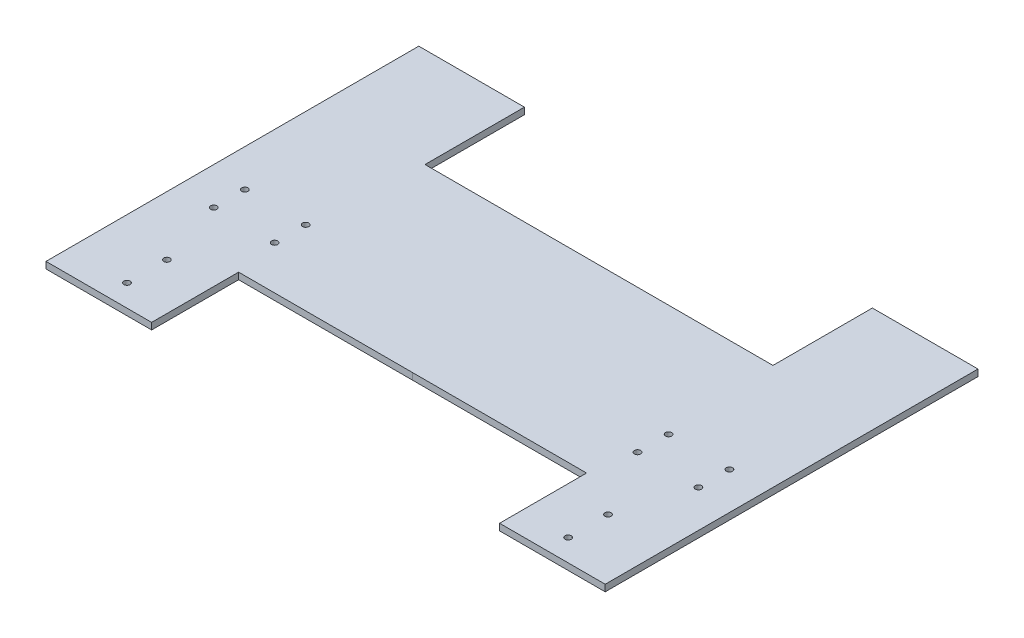
ISO-10303-21;
HEADER;
FILE_DESCRIPTION(('STEP AP214'),'2;1');
FILE_NAME('part.step','',(''),(''),'','','');
FILE_SCHEMA(('AUTOMOTIVE_DESIGN { 1 0 10303 214 1 1 1 1 }'));
ENDSEC;
DATA;
#1=APPLICATION_CONTEXT('core data for automotive mechanical design processes');
#2=APPLICATION_PROTOCOL_DEFINITION('international standard','automotive_design',2000,#1);
#3=PRODUCT_CONTEXT('',#1,'mechanical');
#4=PRODUCT('Part','Part','',(#3));
#5=PRODUCT_RELATED_PRODUCT_CATEGORY('part','',(#4));
#6=PRODUCT_DEFINITION_FORMATION('','',#4);
#7=PRODUCT_DEFINITION_CONTEXT('part definition',#1,'design');
#8=PRODUCT_DEFINITION('design','',#6,#7);
#9=PRODUCT_DEFINITION_SHAPE('','',#8);
#10=(LENGTH_UNIT() NAMED_UNIT(*) SI_UNIT(.MILLI.,.METRE.));
#11=(NAMED_UNIT(*) PLANE_ANGLE_UNIT() SI_UNIT($,.RADIAN.));
#12=(NAMED_UNIT(*) SI_UNIT($,.STERADIAN.) SOLID_ANGLE_UNIT());
#13=UNCERTAINTY_MEASURE_WITH_UNIT(LENGTH_MEASURE(1.E-05),#10,'distance_accuracy_value','');
#14=(GEOMETRIC_REPRESENTATION_CONTEXT(3) GLOBAL_UNCERTAINTY_ASSIGNED_CONTEXT((#13)) GLOBAL_UNIT_ASSIGNED_CONTEXT((#10,
#11,#12)) REPRESENTATION_CONTEXT('',''));
#15=CARTESIAN_POINT('',(0.,0.,0.));
#16=DIRECTION('',(0.,0.,1.));
#17=DIRECTION('',(1.,0.,0.));
#18=AXIS2_PLACEMENT_3D('',#15,#16,#17);
#19=CARTESIAN_POINT('',(-225.,5.314,-150.));
#20=DIRECTION('',(0.,0.,1.));
#21=DIRECTION('',(1.,0.,0.));
#22=AXIS2_PLACEMENT_3D('',#19,#20,#21);
#23=PLANE('',#22);
#24=DIRECTION('',(-1.,0.,0.));
#25=VECTOR('',#24,1.);
#26=CARTESIAN_POINT('',(-225.,0.,-150.));
#27=LINE('',#26,#25);
#28=CARTESIAN_POINT('',(225.,0.,-150.));
#29=VERTEX_POINT('',#28);
#30=CARTESIAN_POINT('',(140.,0.,-150.));
#31=VERTEX_POINT('',#30);
#32=EDGE_CURVE('E281',#29,#31,#27,.T.);
#33=ORIENTED_EDGE('',*,*,#32,.T.);
#34=DIRECTION('',(0.,1.,0.));
#35=VECTOR('',#34,1.);
#36=CARTESIAN_POINT('',(140.,0.,-150.));
#37=LINE('',#36,#35);
#38=CARTESIAN_POINT('',(140.,5.314,-150.));
#39=VERTEX_POINT('',#38);
#40=EDGE_CURVE('E162',#31,#39,#37,.T.);
#41=ORIENTED_EDGE('',*,*,#40,.T.);
#42=DIRECTION('',(-1.,0.,0.));
#43=VECTOR('',#42,1.);
#44=CARTESIAN_POINT('',(-225.,5.314,-150.));
#45=LINE('',#44,#43);
#46=CARTESIAN_POINT('',(225.,5.314,-150.));
#47=VERTEX_POINT('',#46);
#48=EDGE_CURVE('E269',#47,#39,#45,.T.);
#49=ORIENTED_EDGE('',*,*,#48,.F.);
#50=DIRECTION('',(0.,-1.,0.));
#51=VECTOR('',#50,1.);
#52=CARTESIAN_POINT('',(225.,5.314,-150.));
#53=LINE('',#52,#51);
#54=EDGE_CURVE('E297',#47,#29,#53,.T.);
#55=ORIENTED_EDGE('',*,*,#54,.T.);
#56=EDGE_LOOP('',(#33,#41,#49,#55));
#57=FACE_BOUND('',#56,.T.);
#58=ADVANCED_FACE('F37',(#57),#23,.F.);
#59=CARTESIAN_POINT('',(0.,5.314,0.));
#60=DIRECTION('',(0.,-1.,0.));
#61=DIRECTION('',(0.,0.,-1.));
#62=AXIS2_PLACEMENT_3D('',#59,#60,#61);
#63=PLANE('',#62);
#64=CARTESIAN_POINT('',(-177.5,5.314,132.341391099829));
#65=DIRECTION('',(0.,1.,0.));
#66=DIRECTION('',(0.,0.,1.));
#67=AXIS2_PLACEMENT_3D('',#64,#65,#66);
#68=CIRCLE('',#67,2.5);
#69=CARTESIAN_POINT('',(-177.5,5.314,134.841391099829));
#70=VERTEX_POINT('',#69);
#71=EDGE_CURVE('E173',#70,#70,#68,.T.);
#72=ORIENTED_EDGE('',*,*,#71,.F.);
#73=EDGE_LOOP('',(#72));
#74=FACE_BOUND('',#73,.T.);
#75=CARTESIAN_POINT('',(177.5,5.314,132.341391099829));
#76=DIRECTION('',(0.,1.,0.));
#77=DIRECTION('',(0.,0.,1.));
#78=AXIS2_PLACEMENT_3D('',#75,#76,#77);
#79=CIRCLE('',#78,2.5);
#80=CARTESIAN_POINT('',(177.5,5.314,134.841391099829));
#81=VERTEX_POINT('',#80);
#82=EDGE_CURVE('E185',#81,#81,#79,.T.);
#83=ORIENTED_EDGE('',*,*,#82,.F.);
#84=EDGE_LOOP('',(#83));
#85=FACE_BOUND('',#84,.T.);
#86=CARTESIAN_POINT('',(-195.,5.314,45.));
#87=DIRECTION('',(0.,1.,0.));
#88=DIRECTION('',(0.,0.,1.));
#89=AXIS2_PLACEMENT_3D('',#86,#87,#88);
#90=CIRCLE('',#89,2.5);
#91=CARTESIAN_POINT('',(-195.,5.314,47.5));
#92=VERTEX_POINT('',#91);
#93=EDGE_CURVE('E206',#92,#92,#90,.T.);
#94=ORIENTED_EDGE('',*,*,#93,.F.);
#95=EDGE_LOOP('',(#94));
#96=FACE_BOUND('',#95,.T.);
#97=CARTESIAN_POINT('',(-146.,5.314,45.));
#98=DIRECTION('',(0.,1.,0.));
#99=DIRECTION('',(0.,0.,1.));
#100=AXIS2_PLACEMENT_3D('',#97,#98,#99);
#101=CIRCLE('',#100,2.5);
#102=CARTESIAN_POINT('',(-146.,5.314,47.5));
#103=VERTEX_POINT('',#102);
#104=EDGE_CURVE('E221',#103,#103,#101,.T.);
#105=ORIENTED_EDGE('',*,*,#104,.F.);
#106=EDGE_LOOP('',(#105));
#107=FACE_BOUND('',#106,.T.);
#108=CARTESIAN_POINT('',(-146.,5.314,20.));
#109=DIRECTION('',(0.,1.,0.));
#110=DIRECTION('',(0.,0.,1.));
#111=AXIS2_PLACEMENT_3D('',#108,#109,#110);
#112=CIRCLE('',#111,2.5);
#113=CARTESIAN_POINT('',(-146.,5.314,22.5));
#114=VERTEX_POINT('',#113);
#115=EDGE_CURVE('E227',#114,#114,#112,.T.);
#116=ORIENTED_EDGE('',*,*,#115,.F.);
#117=EDGE_LOOP('',(#116));
#118=FACE_BOUND('',#117,.T.);
#119=CARTESIAN_POINT('',(-195.,5.314,20.));
#120=DIRECTION('',(0.,1.,0.));
#121=DIRECTION('',(0.,0.,1.));
#122=AXIS2_PLACEMENT_3D('',#119,#120,#121);
#123=CIRCLE('',#122,2.5);
#124=CARTESIAN_POINT('',(-195.,5.314,22.5));
#125=VERTEX_POINT('',#124);
#126=EDGE_CURVE('E233',#125,#125,#123,.T.);
#127=ORIENTED_EDGE('',*,*,#126,.F.);
#128=EDGE_LOOP('',(#127));
#129=FACE_BOUND('',#128,.T.);
#130=CARTESIAN_POINT('',(146.,5.314,20.));
#131=DIRECTION('',(0.,1.,0.));
#132=DIRECTION('',(0.,0.,1.));
#133=AXIS2_PLACEMENT_3D('',#130,#131,#132);
#134=CIRCLE('',#133,2.5);
#135=CARTESIAN_POINT('',(146.,5.314,22.5));
#136=VERTEX_POINT('',#135);
#137=EDGE_CURVE('E239',#136,#136,#134,.T.);
#138=ORIENTED_EDGE('',*,*,#137,.F.);
#139=EDGE_LOOP('',(#138));
#140=FACE_BOUND('',#139,.T.);
#141=CARTESIAN_POINT('',(195.,5.314,20.));
#142=DIRECTION('',(0.,1.,0.));
#143=DIRECTION('',(0.,0.,1.));
#144=AXIS2_PLACEMENT_3D('',#141,#142,#143);
#145=CIRCLE('',#144,2.5);
#146=CARTESIAN_POINT('',(195.,5.314,22.5));
#147=VERTEX_POINT('',#146);
#148=EDGE_CURVE('E245',#147,#147,#145,.T.);
#149=ORIENTED_EDGE('',*,*,#148,.F.);
#150=EDGE_LOOP('',(#149));
#151=FACE_BOUND('',#150,.T.);
#152=CARTESIAN_POINT('',(195.,5.314,45.));
#153=DIRECTION('',(0.,1.,0.));
#154=DIRECTION('',(0.,0.,1.));
#155=AXIS2_PLACEMENT_3D('',#152,#153,#154);
#156=CIRCLE('',#155,2.5);
#157=CARTESIAN_POINT('',(195.,5.314,47.5));
#158=VERTEX_POINT('',#157);
#159=EDGE_CURVE('E251',#158,#158,#156,.T.);
#160=ORIENTED_EDGE('',*,*,#159,.F.);
#161=EDGE_LOOP('',(#160));
#162=FACE_BOUND('',#161,.T.);
#163=CARTESIAN_POINT('',(146.,5.314,45.));
#164=DIRECTION('',(0.,1.,0.));
#165=DIRECTION('',(0.,0.,1.));
#166=AXIS2_PLACEMENT_3D('',#163,#164,#165);
#167=CIRCLE('',#166,2.5);
#168=CARTESIAN_POINT('',(146.,5.314,47.5));
#169=VERTEX_POINT('',#168);
#170=EDGE_CURVE('E257',#169,#169,#167,.T.);
#171=ORIENTED_EDGE('',*,*,#170,.F.);
#172=EDGE_LOOP('',(#171));
#173=FACE_BOUND('',#172,.T.);
#174=ORIENTED_EDGE('',*,*,#48,.T.);
#175=DIRECTION('',(0.,0.,-1.));
#176=VECTOR('',#175,1.);
#177=CARTESIAN_POINT('',(140.,5.314,-70.));
#178=LINE('',#177,#176);
#179=CARTESIAN_POINT('',(140.,5.314,-70.));
#180=VERTEX_POINT('',#179);
#181=EDGE_CURVE('E154',#180,#39,#178,.T.);
#182=ORIENTED_EDGE('',*,*,#181,.F.);
#183=DIRECTION('',(1.,0.,0.));
#184=VECTOR('',#183,1.);
#185=CARTESIAN_POINT('',(-140.,5.314,-70.));
#186=LINE('',#185,#184);
#187=CARTESIAN_POINT('',(-140.,5.314,-70.));
#188=VERTEX_POINT('',#187);
#189=EDGE_CURVE('E156',#188,#180,#186,.T.);
#190=ORIENTED_EDGE('',*,*,#189,.F.);
#191=DIRECTION('',(0.,0.,1.));
#192=VECTOR('',#191,1.);
#193=CARTESIAN_POINT('',(-140.,5.314,-150.));
#194=LINE('',#193,#192);
#195=CARTESIAN_POINT('',(-140.,5.314,-150.));
#196=VERTEX_POINT('',#195);
#197=EDGE_CURVE('E134',#196,#188,#194,.T.);
#198=ORIENTED_EDGE('',*,*,#197,.F.);
#199=CARTESIAN_POINT('',(-225.,5.314,-150.));
#200=VERTEX_POINT('',#199);
#201=EDGE_CURVE('E267',#196,#200,#45,.T.);
#202=ORIENTED_EDGE('',*,*,#201,.T.);
#203=DIRECTION('',(0.,0.,1.));
#204=VECTOR('',#203,1.);
#205=CARTESIAN_POINT('',(-225.,5.314,150.));
#206=LINE('',#205,#204);
#207=CARTESIAN_POINT('',(-225.,5.314,150.));
#208=VERTEX_POINT('',#207);
#209=EDGE_CURVE('E272',#200,#208,#206,.T.);
#210=ORIENTED_EDGE('',*,*,#209,.T.);
#211=DIRECTION('',(1.,0.,0.));
#212=VECTOR('',#211,1.);
#213=CARTESIAN_POINT('',(-225.,5.314,150.));
#214=LINE('',#213,#212);
#215=CARTESIAN_POINT('',(-140.,5.314,150.));
#216=VERTEX_POINT('',#215);
#217=EDGE_CURVE('E275',#208,#216,#214,.T.);
#218=ORIENTED_EDGE('',*,*,#217,.T.);
#219=DIRECTION('',(0.,0.,1.));
#220=VECTOR('',#219,1.);
#221=CARTESIAN_POINT('',(-140.,5.314,80.));
#222=LINE('',#221,#220);
#223=CARTESIAN_POINT('',(-140.,5.314,80.));
#224=VERTEX_POINT('',#223);
#225=EDGE_CURVE('E197',#224,#216,#222,.T.);
#226=ORIENTED_EDGE('',*,*,#225,.F.);
#227=DIRECTION('',(-1.,0.,0.));
#228=VECTOR('',#227,1.);
#229=CARTESIAN_POINT('',(0.,5.314,80.));
#230=LINE('',#229,#228);
#231=CARTESIAN_POINT('',(0.,5.314,80.));
#232=VERTEX_POINT('',#231);
#233=EDGE_CURVE('E192',#232,#224,#230,.T.);
#234=ORIENTED_EDGE('',*,*,#233,.F.);
#235=DIRECTION('',(-1.,0.,0.));
#236=VECTOR('',#235,1.);
#237=CARTESIAN_POINT('',(0.,5.314,80.));
#238=LINE('',#237,#236);
#239=CARTESIAN_POINT('',(140.,5.314,80.));
#240=VERTEX_POINT('',#239);
#241=EDGE_CURVE('E199',#240,#232,#238,.T.);
#242=ORIENTED_EDGE('',*,*,#241,.F.);
#243=DIRECTION('',(0.,0.,-1.));
#244=VECTOR('',#243,1.);
#245=CARTESIAN_POINT('',(140.,5.314,80.));
#246=LINE('',#245,#244);
#247=CARTESIAN_POINT('',(140.,5.314,150.));
#248=VERTEX_POINT('',#247);
#249=EDGE_CURVE('E203',#248,#240,#246,.T.);
#250=ORIENTED_EDGE('',*,*,#249,.F.);
#251=CARTESIAN_POINT('',(225.,5.314,150.));
#252=VERTEX_POINT('',#251);
#253=EDGE_CURVE('E274',#248,#252,#214,.T.);
#254=ORIENTED_EDGE('',*,*,#253,.T.);
#255=DIRECTION('',(0.,0.,-1.));
#256=VECTOR('',#255,1.);
#257=CARTESIAN_POINT('',(225.,5.314,150.));
#258=LINE('',#257,#256);
#259=EDGE_CURVE('E264',#252,#47,#258,.T.);
#260=ORIENTED_EDGE('',*,*,#259,.T.);
#261=EDGE_LOOP('',(#174,#182,#190,#198,#202,#210,#218,#226,#234,#242,#250,#254,#260));
#262=FACE_BOUND('',#261,.T.);
#263=CARTESIAN_POINT('',(177.5,5.314,100.25262187889));
#264=DIRECTION('',(0.,1.,0.));
#265=DIRECTION('',(0.,0.,1.));
#266=AXIS2_PLACEMENT_3D('',#263,#264,#265);
#267=CIRCLE('',#266,2.5);
#268=CARTESIAN_POINT('',(177.5,5.314,102.75262187889));
#269=VERTEX_POINT('',#268);
#270=EDGE_CURVE('E179',#269,#269,#267,.T.);
#271=ORIENTED_EDGE('',*,*,#270,.F.);
#272=EDGE_LOOP('',(#271));
#273=FACE_BOUND('',#272,.T.);
#274=CARTESIAN_POINT('',(-177.5,5.314,100.25262187889));
#275=DIRECTION('',(0.,1.,0.));
#276=DIRECTION('',(0.,0.,1.));
#277=AXIS2_PLACEMENT_3D('',#274,#275,#276);
#278=CIRCLE('',#277,2.5);
#279=CARTESIAN_POINT('',(-177.5,5.314,102.75262187889));
#280=VERTEX_POINT('',#279);
#281=EDGE_CURVE('E165',#280,#280,#278,.T.);
#282=ORIENTED_EDGE('',*,*,#281,.F.);
#283=EDGE_LOOP('',(#282));
#284=FACE_BOUND('',#283,.T.);
#285=ADVANCED_FACE('F315',(#74,#85,#96,#107,#118,#129,#140,#151,#162,#173,#262,#273,#284),#63,.F.);
#286=CARTESIAN_POINT('',(-225.,5.314,150.));
#287=DIRECTION('',(0.,0.,-1.));
#288=DIRECTION('',(-1.,0.,0.));
#289=AXIS2_PLACEMENT_3D('',#286,#287,#288);
#290=PLANE('',#289);
#291=DIRECTION('',(0.,-1.,0.));
#292=VECTOR('',#291,1.);
#293=CARTESIAN_POINT('',(140.,5.314,150.));
#294=LINE('',#293,#292);
#295=CARTESIAN_POINT('',(140.,0.,150.));
#296=VERTEX_POINT('',#295);
#297=EDGE_CURVE('E202',#248,#296,#294,.T.);
#298=ORIENTED_EDGE('',*,*,#297,.T.);
#299=DIRECTION('',(1.,0.,0.));
#300=VECTOR('',#299,1.);
#301=CARTESIAN_POINT('',(-225.,0.,150.));
#302=LINE('',#301,#300);
#303=CARTESIAN_POINT('',(225.,0.,150.));
#304=VERTEX_POINT('',#303);
#305=EDGE_CURVE('E286',#296,#304,#302,.T.);
#306=ORIENTED_EDGE('',*,*,#305,.T.);
#307=DIRECTION('',(0.,-1.,0.));
#308=VECTOR('',#307,1.);
#309=CARTESIAN_POINT('',(225.,5.314,150.));
#310=LINE('',#309,#308);
#311=EDGE_CURVE('E278',#252,#304,#310,.T.);
#312=ORIENTED_EDGE('',*,*,#311,.F.);
#313=ORIENTED_EDGE('',*,*,#253,.F.);
#314=EDGE_LOOP('',(#298,#306,#312,#313));
#315=FACE_BOUND('',#314,.T.);
#316=ADVANCED_FACE('F343',(#315),#290,.F.);
#317=DIRECTION('',(0.,-1.,0.));
#318=VECTOR('',#317,1.);
#319=CARTESIAN_POINT('',(-140.,5.314,150.));
#320=LINE('',#319,#318);
#321=CARTESIAN_POINT('',(-140.,0.,150.));
#322=VERTEX_POINT('',#321);
#323=EDGE_CURVE('E60',#216,#322,#320,.T.);
#324=ORIENTED_EDGE('',*,*,#323,.F.);
#325=ORIENTED_EDGE('',*,*,#217,.F.);
#326=DIRECTION('',(0.,-1.,0.));
#327=VECTOR('',#326,1.);
#328=CARTESIAN_POINT('',(-225.,5.314,150.));
#329=LINE('',#328,#327);
#330=CARTESIAN_POINT('',(-225.,0.,150.));
#331=VERTEX_POINT('',#330);
#332=EDGE_CURVE('E291',#208,#331,#329,.T.);
#333=ORIENTED_EDGE('',*,*,#332,.T.);
#334=EDGE_CURVE('E268',#331,#322,#302,.T.);
#335=ORIENTED_EDGE('',*,*,#334,.T.);
#336=EDGE_LOOP('',(#324,#325,#333,#335));
#337=FACE_BOUND('',#336,.T.);
#338=ADVANCED_FACE('F323',(#337),#290,.F.);
#339=CARTESIAN_POINT('',(0.,0.,0.));
#340=DIRECTION('',(0.,-1.,0.));
#341=DIRECTION('',(0.,0.,-1.));
#342=AXIS2_PLACEMENT_3D('',#339,#340,#341);
#343=PLANE('',#342);
#344=DIRECTION('',(0.,0.,-1.));
#345=VECTOR('',#344,1.);
#346=CARTESIAN_POINT('',(140.,0.,-70.));
#347=LINE('',#346,#345);
#348=CARTESIAN_POINT('',(140.,0.,-70.));
#349=VERTEX_POINT('',#348);
#350=EDGE_CURVE('E147',#349,#31,#347,.T.);
#351=ORIENTED_EDGE('',*,*,#350,.T.);
#352=ORIENTED_EDGE('',*,*,#32,.F.);
#353=DIRECTION('',(0.,0.,-1.));
#354=VECTOR('',#353,1.);
#355=CARTESIAN_POINT('',(225.,0.,150.));
#356=LINE('',#355,#354);
#357=EDGE_CURVE('E263',#304,#29,#356,.T.);
#358=ORIENTED_EDGE('',*,*,#357,.F.);
#359=ORIENTED_EDGE('',*,*,#305,.F.);
#360=DIRECTION('',(0.,0.,-1.));
#361=VECTOR('',#360,1.);
#362=CARTESIAN_POINT('',(140.,0.,0.));
#363=LINE('',#362,#361);
#364=CARTESIAN_POINT('',(140.,0.,80.));
#365=VERTEX_POINT('',#364);
#366=EDGE_CURVE('E11',#296,#365,#363,.T.);
#367=ORIENTED_EDGE('',*,*,#366,.T.);
#368=DIRECTION('',(-1.,0.,0.));
#369=VECTOR('',#368,1.);
#370=CARTESIAN_POINT('',(0.,0.,80.));
#371=LINE('',#370,#369);
#372=CARTESIAN_POINT('',(0.,0.,80.));
#373=VERTEX_POINT('',#372);
#374=EDGE_CURVE('E45',#365,#373,#371,.T.);
#375=ORIENTED_EDGE('',*,*,#374,.T.);
#376=DIRECTION('',(-1.,0.,0.));
#377=VECTOR('',#376,1.);
#378=CARTESIAN_POINT('',(0.,0.,80.));
#379=LINE('',#378,#377);
#380=CARTESIAN_POINT('',(-140.,0.,80.));
#381=VERTEX_POINT('',#380);
#382=EDGE_CURVE('E302',#373,#381,#379,.T.);
#383=ORIENTED_EDGE('',*,*,#382,.T.);
#384=DIRECTION('',(0.,0.,1.));
#385=VECTOR('',#384,1.);
#386=CARTESIAN_POINT('',(-140.,0.,0.));
#387=LINE('',#386,#385);
#388=EDGE_CURVE('E300',#381,#322,#387,.T.);
#389=ORIENTED_EDGE('',*,*,#388,.T.);
#390=ORIENTED_EDGE('',*,*,#334,.F.);
#391=DIRECTION('',(0.,0.,1.));
#392=VECTOR('',#391,1.);
#393=CARTESIAN_POINT('',(-225.,0.,150.));
#394=LINE('',#393,#392);
#395=CARTESIAN_POINT('',(-225.,0.,-150.));
#396=VERTEX_POINT('',#395);
#397=EDGE_CURVE('E284',#396,#331,#394,.T.);
#398=ORIENTED_EDGE('',*,*,#397,.F.);
#399=CARTESIAN_POINT('',(-140.,0.,-150.));
#400=VERTEX_POINT('',#399);
#401=EDGE_CURVE('E153',#400,#396,#27,.T.);
#402=ORIENTED_EDGE('',*,*,#401,.F.);
#403=DIRECTION('',(0.,0.,1.));
#404=VECTOR('',#403,1.);
#405=CARTESIAN_POINT('',(-140.,0.,-150.));
#406=LINE('',#405,#404);
#407=CARTESIAN_POINT('',(-140.,0.,-70.));
#408=VERTEX_POINT('',#407);
#409=EDGE_CURVE('E52',#400,#408,#406,.T.);
#410=ORIENTED_EDGE('',*,*,#409,.T.);
#411=DIRECTION('',(1.,0.,0.));
#412=VECTOR('',#411,1.);
#413=CARTESIAN_POINT('',(-140.,0.,-70.));
#414=LINE('',#413,#412);
#415=EDGE_CURVE('E142',#408,#349,#414,.T.);
#416=ORIENTED_EDGE('',*,*,#415,.T.);
#417=EDGE_LOOP('',(#351,#352,#358,#359,#367,#375,#383,#389,#390,#398,#402,#410,#416));
#418=FACE_BOUND('',#417,.T.);
#419=CARTESIAN_POINT('',(-177.5,0.,100.25262187889));
#420=DIRECTION('',(0.,-1.,0.));
#421=DIRECTION('',(0.,0.,-1.));
#422=AXIS2_PLACEMENT_3D('',#419,#420,#421);
#423=CIRCLE('',#422,2.5);
#424=CARTESIAN_POINT('',(-177.5,0.,97.7526218788896));
#425=VERTEX_POINT('',#424);
#426=EDGE_CURVE('E170',#425,#425,#423,.T.);
#427=ORIENTED_EDGE('',*,*,#426,.F.);
#428=EDGE_LOOP('',(#427));
#429=FACE_BOUND('',#428,.T.);
#430=CARTESIAN_POINT('',(-177.5,0.,132.341391099829));
#431=DIRECTION('',(0.,-1.,0.));
#432=DIRECTION('',(0.,0.,-1.));
#433=AXIS2_PLACEMENT_3D('',#430,#431,#432);
#434=CIRCLE('',#433,2.5);
#435=CARTESIAN_POINT('',(-177.5,0.,129.841391099829));
#436=VERTEX_POINT('',#435);
#437=EDGE_CURVE('E176',#436,#436,#434,.T.);
#438=ORIENTED_EDGE('',*,*,#437,.F.);
#439=EDGE_LOOP('',(#438));
#440=FACE_BOUND('',#439,.T.);
#441=CARTESIAN_POINT('',(177.5,0.,100.25262187889));
#442=DIRECTION('',(0.,-1.,0.));
#443=DIRECTION('',(0.,0.,-1.));
#444=AXIS2_PLACEMENT_3D('',#441,#442,#443);
#445=CIRCLE('',#444,2.5);
#446=CARTESIAN_POINT('',(177.5,0.,97.7526218788896));
#447=VERTEX_POINT('',#446);
#448=EDGE_CURVE('E182',#447,#447,#445,.T.);
#449=ORIENTED_EDGE('',*,*,#448,.F.);
#450=EDGE_LOOP('',(#449));
#451=FACE_BOUND('',#450,.T.);
#452=CARTESIAN_POINT('',(177.5,0.,132.341391099829));
#453=DIRECTION('',(0.,-1.,0.));
#454=DIRECTION('',(0.,0.,-1.));
#455=AXIS2_PLACEMENT_3D('',#452,#453,#454);
#456=CIRCLE('',#455,2.5);
#457=CARTESIAN_POINT('',(177.5,0.,129.841391099829));
#458=VERTEX_POINT('',#457);
#459=EDGE_CURVE('E188',#458,#458,#456,.T.);
#460=ORIENTED_EDGE('',*,*,#459,.F.);
#461=EDGE_LOOP('',(#460));
#462=FACE_BOUND('',#461,.T.);
#463=CARTESIAN_POINT('',(146.,0.,45.));
#464=DIRECTION('',(0.,-1.,0.));
#465=DIRECTION('',(0.,0.,-1.));
#466=AXIS2_PLACEMENT_3D('',#463,#464,#465);
#467=CIRCLE('',#466,2.5);
#468=CARTESIAN_POINT('',(146.,0.,42.5));
#469=VERTEX_POINT('',#468);
#470=EDGE_CURVE('E260',#469,#469,#467,.T.);
#471=ORIENTED_EDGE('',*,*,#470,.F.);
#472=EDGE_LOOP('',(#471));
#473=FACE_BOUND('',#472,.T.);
#474=CARTESIAN_POINT('',(195.,0.,45.));
#475=DIRECTION('',(0.,-1.,0.));
#476=DIRECTION('',(0.,0.,-1.));
#477=AXIS2_PLACEMENT_3D('',#474,#475,#476);
#478=CIRCLE('',#477,2.5);
#479=CARTESIAN_POINT('',(195.,0.,42.5));
#480=VERTEX_POINT('',#479);
#481=EDGE_CURVE('E254',#480,#480,#478,.T.);
#482=ORIENTED_EDGE('',*,*,#481,.F.);
#483=EDGE_LOOP('',(#482));
#484=FACE_BOUND('',#483,.T.);
#485=CARTESIAN_POINT('',(195.,0.,20.));
#486=DIRECTION('',(0.,-1.,0.));
#487=DIRECTION('',(0.,0.,-1.));
#488=AXIS2_PLACEMENT_3D('',#485,#486,#487);
#489=CIRCLE('',#488,2.5);
#490=CARTESIAN_POINT('',(195.,0.,17.5));
#491=VERTEX_POINT('',#490);
#492=EDGE_CURVE('E248',#491,#491,#489,.T.);
#493=ORIENTED_EDGE('',*,*,#492,.F.);
#494=EDGE_LOOP('',(#493));
#495=FACE_BOUND('',#494,.T.);
#496=CARTESIAN_POINT('',(146.,0.,20.));
#497=DIRECTION('',(0.,-1.,0.));
#498=DIRECTION('',(0.,0.,-1.));
#499=AXIS2_PLACEMENT_3D('',#496,#497,#498);
#500=CIRCLE('',#499,2.5);
#501=CARTESIAN_POINT('',(146.,0.,17.5));
#502=VERTEX_POINT('',#501);
#503=EDGE_CURVE('E242',#502,#502,#500,.T.);
#504=ORIENTED_EDGE('',*,*,#503,.F.);
#505=EDGE_LOOP('',(#504));
#506=FACE_BOUND('',#505,.T.);
#507=CARTESIAN_POINT('',(-195.,0.,20.));
#508=DIRECTION('',(0.,-1.,0.));
#509=DIRECTION('',(0.,0.,-1.));
#510=AXIS2_PLACEMENT_3D('',#507,#508,#509);
#511=CIRCLE('',#510,2.5);
#512=CARTESIAN_POINT('',(-195.,0.,17.5));
#513=VERTEX_POINT('',#512);
#514=EDGE_CURVE('E236',#513,#513,#511,.T.);
#515=ORIENTED_EDGE('',*,*,#514,.F.);
#516=EDGE_LOOP('',(#515));
#517=FACE_BOUND('',#516,.T.);
#518=CARTESIAN_POINT('',(-146.,0.,20.));
#519=DIRECTION('',(0.,-1.,0.));
#520=DIRECTION('',(0.,0.,-1.));
#521=AXIS2_PLACEMENT_3D('',#518,#519,#520);
#522=CIRCLE('',#521,2.5);
#523=CARTESIAN_POINT('',(-146.,0.,17.5));
#524=VERTEX_POINT('',#523);
#525=EDGE_CURVE('E230',#524,#524,#522,.T.);
#526=ORIENTED_EDGE('',*,*,#525,.F.);
#527=EDGE_LOOP('',(#526));
#528=FACE_BOUND('',#527,.T.);
#529=CARTESIAN_POINT('',(-146.,0.,45.));
#530=DIRECTION('',(0.,-1.,0.));
#531=DIRECTION('',(0.,0.,-1.));
#532=AXIS2_PLACEMENT_3D('',#529,#530,#531);
#533=CIRCLE('',#532,2.5);
#534=CARTESIAN_POINT('',(-146.,0.,42.5));
#535=VERTEX_POINT('',#534);
#536=EDGE_CURVE('E224',#535,#535,#533,.T.);
#537=ORIENTED_EDGE('',*,*,#536,.F.);
#538=EDGE_LOOP('',(#537));
#539=FACE_BOUND('',#538,.T.);
#540=CARTESIAN_POINT('',(-195.,0.,45.));
#541=DIRECTION('',(0.,-1.,0.));
#542=DIRECTION('',(0.,0.,-1.));
#543=AXIS2_PLACEMENT_3D('',#540,#541,#542);
#544=CIRCLE('',#543,2.5);
#545=CARTESIAN_POINT('',(-195.,0.,42.5));
#546=VERTEX_POINT('',#545);
#547=EDGE_CURVE('E218',#546,#546,#544,.T.);
#548=ORIENTED_EDGE('',*,*,#547,.F.);
#549=EDGE_LOOP('',(#548));
#550=FACE_BOUND('',#549,.T.);
#551=ADVANCED_FACE('F150',(#418,#429,#440,#451,#462,#473,#484,#495,#506,#517,#528,#539,#550),
#343,.T.);
#552=CARTESIAN_POINT('',(225.,5.314,150.));
#553=DIRECTION('',(-1.,0.,0.));
#554=DIRECTION('',(0.,0.,1.));
#555=AXIS2_PLACEMENT_3D('',#552,#553,#554);
#556=PLANE('',#555);
#557=ORIENTED_EDGE('',*,*,#357,.T.);
#558=ORIENTED_EDGE('',*,*,#54,.F.);
#559=ORIENTED_EDGE('',*,*,#259,.F.);
#560=ORIENTED_EDGE('',*,*,#311,.T.);
#561=EDGE_LOOP('',(#557,#558,#559,#560));
#562=FACE_BOUND('',#561,.T.);
#563=ADVANCED_FACE('F39',(#562),#556,.F.);
#564=ORIENTED_EDGE('',*,*,#201,.F.);
#565=DIRECTION('',(0.,1.,0.));
#566=VECTOR('',#565,1.);
#567=CARTESIAN_POINT('',(-140.,0.,-150.));
#568=LINE('',#567,#566);
#569=EDGE_CURVE('E139',#400,#196,#568,.T.);
#570=ORIENTED_EDGE('',*,*,#569,.F.);
#571=ORIENTED_EDGE('',*,*,#401,.T.);
#572=DIRECTION('',(0.,-1.,0.));
#573=VECTOR('',#572,1.);
#574=CARTESIAN_POINT('',(-225.,5.314,-150.));
#575=LINE('',#574,#573);
#576=EDGE_CURVE('E294',#200,#396,#575,.T.);
#577=ORIENTED_EDGE('',*,*,#576,.F.);
#578=EDGE_LOOP('',(#564,#570,#571,#577));
#579=FACE_BOUND('',#578,.T.);
#580=ADVANCED_FACE('F332',(#579),#23,.F.);
#581=CARTESIAN_POINT('',(-225.,5.314,150.));
#582=DIRECTION('',(1.,0.,0.));
#583=DIRECTION('',(0.,0.,-1.));
#584=AXIS2_PLACEMENT_3D('',#581,#582,#583);
#585=PLANE('',#584);
#586=ORIENTED_EDGE('',*,*,#397,.T.);
#587=ORIENTED_EDGE('',*,*,#332,.F.);
#588=ORIENTED_EDGE('',*,*,#209,.F.);
#589=ORIENTED_EDGE('',*,*,#576,.T.);
#590=EDGE_LOOP('',(#586,#587,#588,#589));
#591=FACE_BOUND('',#590,.T.);
#592=ADVANCED_FACE('F328',(#591),#585,.F.);
#593=CARTESIAN_POINT('',(146.,5.314,45.));
#594=DIRECTION('',(0.,1.,0.));
#595=DIRECTION('',(0.,0.,1.));
#596=AXIS2_PLACEMENT_3D('',#593,#594,#595);
#597=CYLINDRICAL_SURFACE('',#596,2.5);
#598=ORIENTED_EDGE('',*,*,#170,.T.);
#599=EDGE_LOOP('',(#598));
#600=FACE_BOUND('',#599,.T.);
#601=ORIENTED_EDGE('',*,*,#470,.T.);
#602=EDGE_LOOP('',(#601));
#603=FACE_BOUND('',#602,.T.);
#604=ADVANCED_FACE('F366',(#600,#603),#597,.F.);
#605=CARTESIAN_POINT('',(195.,5.314,45.));
#606=DIRECTION('',(0.,1.,0.));
#607=DIRECTION('',(0.,0.,1.));
#608=AXIS2_PLACEMENT_3D('',#605,#606,#607);
#609=CYLINDRICAL_SURFACE('',#608,2.5);
#610=ORIENTED_EDGE('',*,*,#159,.T.);
#611=EDGE_LOOP('',(#610));
#612=FACE_BOUND('',#611,.T.);
#613=ORIENTED_EDGE('',*,*,#481,.T.);
#614=EDGE_LOOP('',(#613));
#615=FACE_BOUND('',#614,.T.);
#616=ADVANCED_FACE('F375',(#612,#615),#609,.F.);
#617=CARTESIAN_POINT('',(195.,5.314,20.));
#618=DIRECTION('',(0.,1.,0.));
#619=DIRECTION('',(0.,0.,1.));
#620=AXIS2_PLACEMENT_3D('',#617,#618,#619);
#621=CYLINDRICAL_SURFACE('',#620,2.5);
#622=ORIENTED_EDGE('',*,*,#148,.T.);
#623=EDGE_LOOP('',(#622));
#624=FACE_BOUND('',#623,.T.);
#625=ORIENTED_EDGE('',*,*,#492,.T.);
#626=EDGE_LOOP('',(#625));
#627=FACE_BOUND('',#626,.T.);
#628=ADVANCED_FACE('F379',(#624,#627),#621,.F.);
#629=CARTESIAN_POINT('',(146.,5.314,20.));
#630=DIRECTION('',(0.,1.,0.));
#631=DIRECTION('',(0.,0.,1.));
#632=AXIS2_PLACEMENT_3D('',#629,#630,#631);
#633=CYLINDRICAL_SURFACE('',#632,2.5);
#634=ORIENTED_EDGE('',*,*,#137,.T.);
#635=EDGE_LOOP('',(#634));
#636=FACE_BOUND('',#635,.T.);
#637=ORIENTED_EDGE('',*,*,#503,.T.);
#638=EDGE_LOOP('',(#637));
#639=FACE_BOUND('',#638,.T.);
#640=ADVANCED_FACE('F383',(#636,#639),#633,.F.);
#641=CARTESIAN_POINT('',(-195.,5.314,20.));
#642=DIRECTION('',(0.,1.,0.));
#643=DIRECTION('',(0.,0.,1.));
#644=AXIS2_PLACEMENT_3D('',#641,#642,#643);
#645=CYLINDRICAL_SURFACE('',#644,2.5);
#646=ORIENTED_EDGE('',*,*,#126,.T.);
#647=EDGE_LOOP('',(#646));
#648=FACE_BOUND('',#647,.T.);
#649=ORIENTED_EDGE('',*,*,#514,.T.);
#650=EDGE_LOOP('',(#649));
#651=FACE_BOUND('',#650,.T.);
#652=ADVANCED_FACE('F387',(#648,#651),#645,.F.);
#653=CARTESIAN_POINT('',(-146.,5.314,20.));
#654=DIRECTION('',(0.,1.,0.));
#655=DIRECTION('',(0.,0.,1.));
#656=AXIS2_PLACEMENT_3D('',#653,#654,#655);
#657=CYLINDRICAL_SURFACE('',#656,2.5);
#658=ORIENTED_EDGE('',*,*,#115,.T.);
#659=EDGE_LOOP('',(#658));
#660=FACE_BOUND('',#659,.T.);
#661=ORIENTED_EDGE('',*,*,#525,.T.);
#662=EDGE_LOOP('',(#661));
#663=FACE_BOUND('',#662,.T.);
#664=ADVANCED_FACE('F391',(#660,#663),#657,.F.);
#665=CARTESIAN_POINT('',(-146.,5.314,45.));
#666=DIRECTION('',(0.,1.,0.));
#667=DIRECTION('',(0.,0.,1.));
#668=AXIS2_PLACEMENT_3D('',#665,#666,#667);
#669=CYLINDRICAL_SURFACE('',#668,2.5);
#670=ORIENTED_EDGE('',*,*,#104,.T.);
#671=EDGE_LOOP('',(#670));
#672=FACE_BOUND('',#671,.T.);
#673=ORIENTED_EDGE('',*,*,#536,.T.);
#674=EDGE_LOOP('',(#673));
#675=FACE_BOUND('',#674,.T.);
#676=ADVANCED_FACE('F395',(#672,#675),#669,.F.);
#677=CARTESIAN_POINT('',(-195.,5.314,45.));
#678=DIRECTION('',(0.,1.,0.));
#679=DIRECTION('',(0.,0.,1.));
#680=AXIS2_PLACEMENT_3D('',#677,#678,#679);
#681=CYLINDRICAL_SURFACE('',#680,2.5);
#682=ORIENTED_EDGE('',*,*,#93,.T.);
#683=EDGE_LOOP('',(#682));
#684=FACE_BOUND('',#683,.T.);
#685=ORIENTED_EDGE('',*,*,#547,.T.);
#686=EDGE_LOOP('',(#685));
#687=FACE_BOUND('',#686,.T.);
#688=ADVANCED_FACE('F399',(#684,#687),#681,.F.);
#689=CARTESIAN_POINT('',(140.,5.314,80.));
#690=DIRECTION('',(-1.,0.,0.));
#691=DIRECTION('',(0.,0.,1.));
#692=AXIS2_PLACEMENT_3D('',#689,#690,#691);
#693=PLANE('',#692);
#694=ORIENTED_EDGE('',*,*,#366,.F.);
#695=ORIENTED_EDGE('',*,*,#297,.F.);
#696=ORIENTED_EDGE('',*,*,#249,.T.);
#697=DIRECTION('',(0.,-1.,0.));
#698=VECTOR('',#697,1.);
#699=CARTESIAN_POINT('',(140.,5.314,80.));
#700=LINE('',#699,#698);
#701=EDGE_CURVE('E195',#240,#365,#700,.T.);
#702=ORIENTED_EDGE('',*,*,#701,.T.);
#703=EDGE_LOOP('',(#694,#695,#696,#702));
#704=FACE_BOUND('',#703,.T.);
#705=ADVANCED_FACE('F309',(#704),#693,.T.);
#706=CARTESIAN_POINT('',(0.,5.314,80.));
#707=DIRECTION('',(0.,0.,1.));
#708=DIRECTION('',(1.,0.,0.));
#709=AXIS2_PLACEMENT_3D('',#706,#707,#708);
#710=PLANE('',#709);
#711=ORIENTED_EDGE('',*,*,#374,.F.);
#712=ORIENTED_EDGE('',*,*,#701,.F.);
#713=ORIENTED_EDGE('',*,*,#241,.T.);
#714=DIRECTION('',(0.,-1.,0.));
#715=VECTOR('',#714,1.);
#716=CARTESIAN_POINT('',(0.,5.314,80.));
#717=LINE('',#716,#715);
#718=EDGE_CURVE('E196',#232,#373,#717,.T.);
#719=ORIENTED_EDGE('',*,*,#718,.T.);
#720=EDGE_LOOP('',(#711,#712,#713,#719));
#721=FACE_BOUND('',#720,.T.);
#722=ADVANCED_FACE('F307',(#721),#710,.T.);
#723=CARTESIAN_POINT('',(0.,5.314,80.));
#724=DIRECTION('',(0.,0.,1.));
#725=DIRECTION('',(1.,0.,0.));
#726=AXIS2_PLACEMENT_3D('',#723,#724,#725);
#727=PLANE('',#726);
#728=ORIENTED_EDGE('',*,*,#382,.F.);
#729=ORIENTED_EDGE('',*,*,#718,.F.);
#730=ORIENTED_EDGE('',*,*,#233,.T.);
#731=DIRECTION('',(0.,-1.,0.));
#732=VECTOR('',#731,1.);
#733=CARTESIAN_POINT('',(-140.,5.314,80.));
#734=LINE('',#733,#732);
#735=EDGE_CURVE('E191',#224,#381,#734,.T.);
#736=ORIENTED_EDGE('',*,*,#735,.T.);
#737=EDGE_LOOP('',(#728,#729,#730,#736));
#738=FACE_BOUND('',#737,.T.);
#739=ADVANCED_FACE('F319',(#738),#727,.T.);
#740=CARTESIAN_POINT('',(-140.,5.314,80.));
#741=DIRECTION('',(1.,0.,0.));
#742=DIRECTION('',(0.,0.,-1.));
#743=AXIS2_PLACEMENT_3D('',#740,#741,#742);
#744=PLANE('',#743);
#745=ORIENTED_EDGE('',*,*,#388,.F.);
#746=ORIENTED_EDGE('',*,*,#735,.F.);
#747=ORIENTED_EDGE('',*,*,#225,.T.);
#748=ORIENTED_EDGE('',*,*,#323,.T.);
#749=EDGE_LOOP('',(#745,#746,#747,#748));
#750=FACE_BOUND('',#749,.T.);
#751=ADVANCED_FACE('F320',(#750),#744,.T.);
#752=CARTESIAN_POINT('',(177.5,5.314,132.341391099829));
#753=DIRECTION('',(0.,1.,0.));
#754=DIRECTION('',(0.,0.,1.));
#755=AXIS2_PLACEMENT_3D('',#752,#753,#754);
#756=CYLINDRICAL_SURFACE('',#755,2.5);
#757=ORIENTED_EDGE('',*,*,#82,.T.);
#758=EDGE_LOOP('',(#757));
#759=FACE_BOUND('',#758,.T.);
#760=ORIENTED_EDGE('',*,*,#459,.T.);
#761=EDGE_LOOP('',(#760));
#762=FACE_BOUND('',#761,.T.);
#763=ADVANCED_FACE('F412',(#759,#762),#756,.F.);
#764=CARTESIAN_POINT('',(177.5,5.314,100.25262187889));
#765=DIRECTION('',(0.,1.,0.));
#766=DIRECTION('',(0.,0.,1.));
#767=AXIS2_PLACEMENT_3D('',#764,#765,#766);
#768=CYLINDRICAL_SURFACE('',#767,2.5);
#769=ORIENTED_EDGE('',*,*,#270,.T.);
#770=EDGE_LOOP('',(#769));
#771=FACE_BOUND('',#770,.T.);
#772=ORIENTED_EDGE('',*,*,#448,.T.);
#773=EDGE_LOOP('',(#772));
#774=FACE_BOUND('',#773,.T.);
#775=ADVANCED_FACE('F415',(#771,#774),#768,.F.);
#776=CARTESIAN_POINT('',(-177.5,5.314,132.341391099829));
#777=DIRECTION('',(0.,1.,0.));
#778=DIRECTION('',(0.,0.,1.));
#779=AXIS2_PLACEMENT_3D('',#776,#777,#778);
#780=CYLINDRICAL_SURFACE('',#779,2.5);
#781=ORIENTED_EDGE('',*,*,#71,.T.);
#782=EDGE_LOOP('',(#781));
#783=FACE_BOUND('',#782,.T.);
#784=ORIENTED_EDGE('',*,*,#437,.T.);
#785=EDGE_LOOP('',(#784));
#786=FACE_BOUND('',#785,.T.);
#787=ADVANCED_FACE('F419',(#783,#786),#780,.F.);
#788=CARTESIAN_POINT('',(-177.5,5.314,100.25262187889));
#789=DIRECTION('',(0.,1.,0.));
#790=DIRECTION('',(0.,0.,1.));
#791=AXIS2_PLACEMENT_3D('',#788,#789,#790);
#792=CYLINDRICAL_SURFACE('',#791,2.5);
#793=ORIENTED_EDGE('',*,*,#281,.T.);
#794=EDGE_LOOP('',(#793));
#795=FACE_BOUND('',#794,.T.);
#796=ORIENTED_EDGE('',*,*,#426,.T.);
#797=EDGE_LOOP('',(#796));
#798=FACE_BOUND('',#797,.T.);
#799=ADVANCED_FACE('F423',(#795,#798),#792,.F.);
#800=CARTESIAN_POINT('',(140.,0.,-70.));
#801=DIRECTION('',(1.,0.,0.));
#802=DIRECTION('',(0.,0.,-1.));
#803=AXIS2_PLACEMENT_3D('',#800,#801,#802);
#804=PLANE('',#803);
#805=ORIENTED_EDGE('',*,*,#181,.T.);
#806=ORIENTED_EDGE('',*,*,#40,.F.);
#807=ORIENTED_EDGE('',*,*,#350,.F.);
#808=DIRECTION('',(0.,1.,0.));
#809=VECTOR('',#808,1.);
#810=CARTESIAN_POINT('',(140.,0.,-70.));
#811=LINE('',#810,#809);
#812=EDGE_CURVE('E138',#349,#180,#811,.T.);
#813=ORIENTED_EDGE('',*,*,#812,.T.);
#814=EDGE_LOOP('',(#805,#806,#807,#813));
#815=FACE_BOUND('',#814,.T.);
#816=ADVANCED_FACE('F335',(#815),#804,.F.);
#817=CARTESIAN_POINT('',(-140.,0.,-70.));
#818=DIRECTION('',(0.,0.,1.));
#819=DIRECTION('',(1.,0.,0.));
#820=AXIS2_PLACEMENT_3D('',#817,#818,#819);
#821=PLANE('',#820);
#822=ORIENTED_EDGE('',*,*,#189,.T.);
#823=ORIENTED_EDGE('',*,*,#812,.F.);
#824=ORIENTED_EDGE('',*,*,#415,.F.);
#825=DIRECTION('',(0.,1.,0.));
#826=VECTOR('',#825,1.);
#827=CARTESIAN_POINT('',(-140.,0.,-70.));
#828=LINE('',#827,#826);
#829=EDGE_CURVE('E130',#408,#188,#828,.T.);
#830=ORIENTED_EDGE('',*,*,#829,.T.);
#831=EDGE_LOOP('',(#822,#823,#824,#830));
#832=FACE_BOUND('',#831,.T.);
#833=ADVANCED_FACE('F143',(#832),#821,.F.);
#834=CARTESIAN_POINT('',(-140.,0.,-150.));
#835=DIRECTION('',(-1.,0.,0.));
#836=DIRECTION('',(0.,0.,1.));
#837=AXIS2_PLACEMENT_3D('',#834,#835,#836);
#838=PLANE('',#837);
#839=ORIENTED_EDGE('',*,*,#197,.T.);
#840=ORIENTED_EDGE('',*,*,#829,.F.);
#841=ORIENTED_EDGE('',*,*,#409,.F.);
#842=ORIENTED_EDGE('',*,*,#569,.T.);
#843=EDGE_LOOP('',(#839,#840,#841,#842));
#844=FACE_BOUND('',#843,.T.);
#845=ADVANCED_FACE('F132',(#844),#838,.F.);
#846=CLOSED_SHELL('',(#58,#285,#316,#338,#551,#563,#580,#592,#604,#616,#628,#640,#652,#664,#676,
#688,#705,#722,#739,#751,#763,#775,#787,#799,#816,#833,#845));
#847=MANIFOLD_SOLID_BREP('B2',#846);
#848=ADVANCED_BREP_SHAPE_REPRESENTATION('',(#18,#847),#14);
#849=SHAPE_DEFINITION_REPRESENTATION(#9,#848);
ENDSEC;
END-ISO-10303-21;
